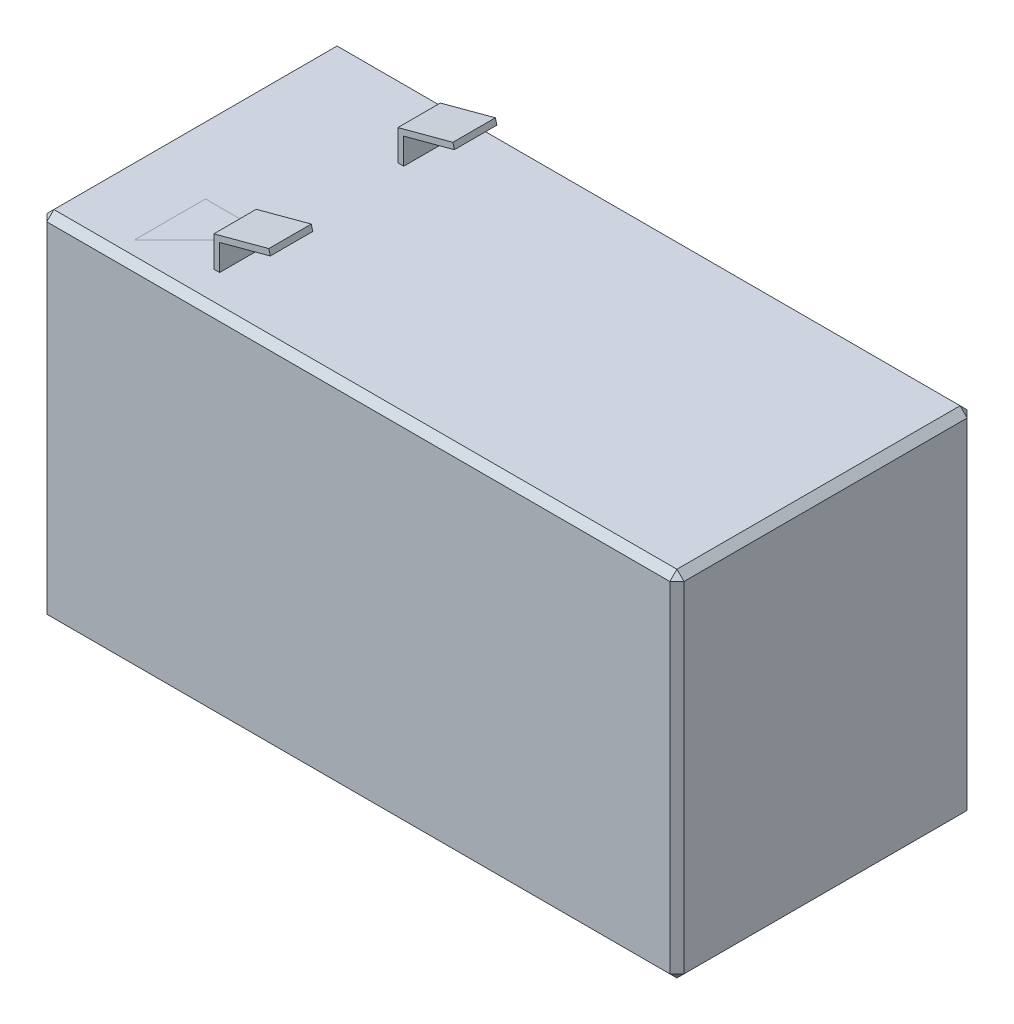
ISO-10303-21;
HEADER;
FILE_DESCRIPTION(('STEP AP214'),'2;1');
FILE_NAME('part.step','',(''),(''),'','','');
FILE_SCHEMA(('AUTOMOTIVE_DESIGN { 1 0 10303 214 1 1 1 1 }'));
ENDSEC;
DATA;
#1=APPLICATION_CONTEXT('core data for automotive mechanical design processes');
#2=APPLICATION_PROTOCOL_DEFINITION('international standard','automotive_design',2000,#1);
#3=PRODUCT_CONTEXT('',#1,'mechanical');
#4=PRODUCT('Part','Part','',(#3));
#5=PRODUCT_RELATED_PRODUCT_CATEGORY('part','',(#4));
#6=PRODUCT_DEFINITION_FORMATION('','',#4);
#7=PRODUCT_DEFINITION_CONTEXT('part definition',#1,'design');
#8=PRODUCT_DEFINITION('design','',#6,#7);
#9=PRODUCT_DEFINITION_SHAPE('','',#8);
#10=(LENGTH_UNIT() NAMED_UNIT(*) SI_UNIT(.MILLI.,.METRE.));
#11=(NAMED_UNIT(*) PLANE_ANGLE_UNIT() SI_UNIT($,.RADIAN.));
#12=(NAMED_UNIT(*) SI_UNIT($,.STERADIAN.) SOLID_ANGLE_UNIT());
#13=UNCERTAINTY_MEASURE_WITH_UNIT(LENGTH_MEASURE(1.E-05),#10,'distance_accuracy_value','');
#14=(GEOMETRIC_REPRESENTATION_CONTEXT(3) GLOBAL_UNCERTAINTY_ASSIGNED_CONTEXT((#13)) GLOBAL_UNIT_ASSIGNED_CONTEXT((#10,
#11,#12)) REPRESENTATION_CONTEXT('',''));
#15=CARTESIAN_POINT('',(0.,0.,0.));
#16=DIRECTION('',(0.,0.,1.));
#17=DIRECTION('',(1.,0.,0.));
#18=AXIS2_PLACEMENT_3D('',#15,#16,#17);
#19=CARTESIAN_POINT('',(0.,50.,0.));
#20=DIRECTION('',(0.,1.,0.));
#21=DIRECTION('',(0.,0.,1.));
#22=AXIS2_PLACEMENT_3D('',#19,#20,#21);
#23=PLANE('',#22);
#24=DIRECTION('',(0.,0.,-1.));
#25=VECTOR('',#24,1.);
#26=CARTESIAN_POINT('',(-24.585,50.,-7.99999999999999));
#27=LINE('',#26,#25);
#28=CARTESIAN_POINT('',(-24.585,50.,-7.99999999999999));
#29=VERTEX_POINT('',#28);
#30=CARTESIAN_POINT('',(-24.585,50.,-18.));
#31=VERTEX_POINT('',#30);
#32=EDGE_CURVE('E73',#29,#31,#27,.T.);
#33=ORIENTED_EDGE('',*,*,#32,.T.);
#34=DIRECTION('',(-1.,0.,0.));
#35=VECTOR('',#34,1.);
#36=CARTESIAN_POINT('',(-24.585,50.,-18.));
#37=LINE('',#36,#35);
#38=CARTESIAN_POINT('',(-34.585,50.,-18.));
#39=VERTEX_POINT('',#38);
#40=EDGE_CURVE('E84',#31,#39,#37,.T.);
#41=ORIENTED_EDGE('',*,*,#40,.T.);
#42=DIRECTION('',(0.,0.,1.));
#43=VECTOR('',#42,1.);
#44=CARTESIAN_POINT('',(-34.585,50.,-7.99999999999999));
#45=LINE('',#44,#43);
#46=CARTESIAN_POINT('',(-34.585,50.,-7.99999999999999));
#47=VERTEX_POINT('',#46);
#48=EDGE_CURVE('E69',#39,#47,#45,.T.);
#49=ORIENTED_EDGE('',*,*,#48,.T.);
#50=DIRECTION('',(1.,0.,0.));
#51=VECTOR('',#50,1.);
#52=CARTESIAN_POINT('',(-24.585,50.,-7.99999999999999));
#53=LINE('',#52,#51);
#54=EDGE_CURVE('E12',#47,#29,#53,.T.);
#55=ORIENTED_EDGE('',*,*,#54,.T.);
#56=EDGE_LOOP('',(#33,#41,#49,#55));
#57=FACE_BOUND('',#56,.T.);
#58=ADVANCED_FACE('F64',(#57),#23,.T.);
#59=OPEN_SHELL('',(#58));
#60=SHELL_BASED_SURFACE_MODEL('B2',(#59));
#61=CARTESIAN_POINT('',(0.,50.,0.));
#62=DIRECTION('',(0.,-1.,0.));
#63=DIRECTION('',(0.,0.,-1.));
#64=AXIS2_PLACEMENT_3D('',#61,#62,#63);
#65=PLANE('',#64);
#66=DIRECTION('',(0.,0.,-1.));
#67=VECTOR('',#66,1.);
#68=CARTESIAN_POINT('',(-24.585,50.,7.99999999999999));
#69=LINE('',#68,#67);
#70=CARTESIAN_POINT('',(-24.585,50.,18.));
#71=VERTEX_POINT('',#70);
#72=CARTESIAN_POINT('',(-24.585,50.,7.99999999999999));
#73=VERTEX_POINT('',#72);
#74=EDGE_CURVE('E133',#71,#73,#69,.T.);
#75=ORIENTED_EDGE('',*,*,#74,.T.);
#76=DIRECTION('',(-1.,0.,0.));
#77=VECTOR('',#76,1.);
#78=CARTESIAN_POINT('',(-24.585,50.,7.99999999999999));
#79=LINE('',#78,#77);
#80=CARTESIAN_POINT('',(-34.585,50.,8.));
#81=VERTEX_POINT('',#80);
#82=EDGE_CURVE('E144',#73,#81,#79,.T.);
#83=ORIENTED_EDGE('',*,*,#82,.T.);
#84=DIRECTION('',(0.,0.,1.));
#85=VECTOR('',#84,1.);
#86=CARTESIAN_POINT('',(-34.585,50.,8.));
#87=LINE('',#86,#85);
#88=CARTESIAN_POINT('',(-34.585,50.,18.));
#89=VERTEX_POINT('',#88);
#90=EDGE_CURVE('E129',#81,#89,#87,.T.);
#91=ORIENTED_EDGE('',*,*,#90,.T.);
#92=DIRECTION('',(1.,0.,0.));
#93=VECTOR('',#92,1.);
#94=CARTESIAN_POINT('',(-24.585,50.,18.));
#95=LINE('',#94,#93);
#96=EDGE_CURVE('E62',#89,#71,#95,.T.);
#97=ORIENTED_EDGE('',*,*,#96,.T.);
#98=EDGE_LOOP('',(#75,#83,#91,#97));
#99=FACE_BOUND('',#98,.T.);
#100=ADVANCED_FACE('F124',(#99),#65,.F.);
#101=OPEN_SHELL('',(#100));
#102=SHELL_BASED_SURFACE_MODEL('B6',(#101));
#103=CARTESIAN_POINT('',(0.,50.,0.));
#104=DIRECTION('',(0.,-1.,0.));
#105=DIRECTION('',(0.,0.,-1.));
#106=AXIS2_PLACEMENT_3D('',#103,#104,#105);
#107=PLANE('',#106);
#108=DIRECTION('',(-1.,0.,0.));
#109=VECTOR('',#108,1.);
#110=CARTESIAN_POINT('',(-24.585,50.,16.));
#111=LINE('',#110,#109);
#112=CARTESIAN_POINT('',(-24.585,50.,16.));
#113=VERTEX_POINT('',#112);
#114=CARTESIAN_POINT('',(-25.415,50.,16.));
#115=VERTEX_POINT('',#114);
#116=EDGE_CURVE('E431',#113,#115,#111,.T.);
#117=ORIENTED_EDGE('',*,*,#116,.T.);
#118=DIRECTION('',(0.,0.,-1.));
#119=VECTOR('',#118,1.);
#120=CARTESIAN_POINT('',(-25.415,50.,16.));
#121=LINE('',#120,#119);
#122=CARTESIAN_POINT('',(-25.415,50.,10.));
#123=VERTEX_POINT('',#122);
#124=EDGE_CURVE('E465',#115,#123,#121,.T.);
#125=ORIENTED_EDGE('',*,*,#124,.T.);
#126=DIRECTION('',(-1.,0.,0.));
#127=VECTOR('',#126,1.);
#128=CARTESIAN_POINT('',(-24.585,50.,10.));
#129=LINE('',#128,#127);
#130=CARTESIAN_POINT('',(-24.585,50.,10.));
#131=VERTEX_POINT('',#130);
#132=EDGE_CURVE('E454',#131,#123,#129,.T.);
#133=ORIENTED_EDGE('',*,*,#132,.F.);
#134=DIRECTION('',(0.,0.,-1.));
#135=VECTOR('',#134,1.);
#136=CARTESIAN_POINT('',(-24.585,50.,16.));
#137=LINE('',#136,#135);
#138=EDGE_CURVE('E462',#113,#131,#137,.T.);
#139=ORIENTED_EDGE('',*,*,#138,.F.);
#140=EDGE_LOOP('',(#117,#125,#133,#139));
#141=FACE_BOUND('',#140,.T.);
#142=DIRECTION('',(0.,0.,-1.));
#143=VECTOR('',#142,1.);
#144=CARTESIAN_POINT('',(44.,50.,0.));
#145=LINE('',#144,#143);
#146=CARTESIAN_POINT('',(44.,50.,20.));
#147=VERTEX_POINT('',#146);
#148=CARTESIAN_POINT('',(44.,50.,-20.));
#149=VERTEX_POINT('',#148);
#150=EDGE_CURVE('E508',#147,#149,#145,.T.);
#151=ORIENTED_EDGE('',*,*,#150,.T.);
#152=DIRECTION('',(-1.,0.,0.));
#153=VECTOR('',#152,1.);
#154=CARTESIAN_POINT('',(0.,50.,-20.));
#155=LINE('',#154,#153);
#156=CARTESIAN_POINT('',(-44.,50.,-20.));
#157=VERTEX_POINT('',#156);
#158=EDGE_CURVE('E515',#149,#157,#155,.T.);
#159=ORIENTED_EDGE('',*,*,#158,.T.);
#160=DIRECTION('',(0.,0.,1.));
#161=VECTOR('',#160,1.);
#162=CARTESIAN_POINT('',(-44.,50.,0.));
#163=LINE('',#162,#161);
#164=CARTESIAN_POINT('',(-44.,50.,20.));
#165=VERTEX_POINT('',#164);
#166=EDGE_CURVE('E511',#157,#165,#163,.T.);
#167=ORIENTED_EDGE('',*,*,#166,.T.);
#168=DIRECTION('',(1.,0.,0.));
#169=VECTOR('',#168,1.);
#170=CARTESIAN_POINT('',(0.,50.,20.));
#171=LINE('',#170,#169);
#172=EDGE_CURVE('E505',#165,#147,#171,.T.);
#173=ORIENTED_EDGE('',*,*,#172,.T.);
#174=EDGE_LOOP('',(#151,#159,#167,#173));
#175=FACE_BOUND('',#174,.T.);
#176=DIRECTION('',(-1.,0.,0.));
#177=VECTOR('',#176,1.);
#178=CARTESIAN_POINT('',(-24.585,50.,-16.));
#179=LINE('',#178,#177);
#180=CARTESIAN_POINT('',(-24.585,50.,-16.));
#181=VERTEX_POINT('',#180);
#182=CARTESIAN_POINT('',(-25.415,50.,-16.));
#183=VERTEX_POINT('',#182);
#184=EDGE_CURVE('E369',#181,#183,#179,.T.);
#185=ORIENTED_EDGE('',*,*,#184,.F.);
#186=DIRECTION('',(0.,0.,1.));
#187=VECTOR('',#186,1.);
#188=CARTESIAN_POINT('',(-24.585,50.,-16.));
#189=LINE('',#188,#187);
#190=CARTESIAN_POINT('',(-24.585,50.,-10.));
#191=VERTEX_POINT('',#190);
#192=EDGE_CURVE('E353',#181,#191,#189,.T.);
#193=ORIENTED_EDGE('',*,*,#192,.T.);
#194=DIRECTION('',(-1.,0.,0.));
#195=VECTOR('',#194,1.);
#196=CARTESIAN_POINT('',(-24.585,50.,-10.));
#197=LINE('',#196,#195);
#198=CARTESIAN_POINT('',(-25.415,50.,-10.));
#199=VERTEX_POINT('',#198);
#200=EDGE_CURVE('E390',#191,#199,#197,.T.);
#201=ORIENTED_EDGE('',*,*,#200,.T.);
#202=DIRECTION('',(0.,0.,1.));
#203=VECTOR('',#202,1.);
#204=CARTESIAN_POINT('',(-25.415,50.,-16.));
#205=LINE('',#204,#203);
#206=EDGE_CURVE('E411',#183,#199,#205,.T.);
#207=ORIENTED_EDGE('',*,*,#206,.F.);
#208=EDGE_LOOP('',(#185,#193,#201,#207));
#209=FACE_BOUND('',#208,.T.);
#210=ADVANCED_FACE('F175',(#141,#175,#209),#107,.F.);
#211=CARTESIAN_POINT('',(45.,50.,21.));
#212=DIRECTION('',(-1.,0.,0.));
#213=DIRECTION('',(0.,0.,1.));
#214=AXIS2_PLACEMENT_3D('',#211,#212,#213);
#215=PLANE('',#214);
#216=DIRECTION('',(0.,1.,0.));
#217=VECTOR('',#216,1.);
#218=CARTESIAN_POINT('',(45.,50.,-20.));
#219=LINE('',#218,#217);
#220=CARTESIAN_POINT('',(45.,0.999999999999987,-20.));
#221=VERTEX_POINT('',#220);
#222=CARTESIAN_POINT('',(45.,49.,-20.));
#223=VERTEX_POINT('',#222);
#224=EDGE_CURVE('E524',#221,#223,#219,.T.);
#225=ORIENTED_EDGE('',*,*,#224,.T.);
#226=DIRECTION('',(0.,0.,1.));
#227=VECTOR('',#226,1.);
#228=CARTESIAN_POINT('',(45.,49.,21.));
#229=LINE('',#228,#227);
#230=CARTESIAN_POINT('',(45.,49.,20.));
#231=VERTEX_POINT('',#230);
#232=EDGE_CURVE('E527',#223,#231,#229,.T.);
#233=ORIENTED_EDGE('',*,*,#232,.T.);
#234=DIRECTION('',(0.,-1.,0.));
#235=VECTOR('',#234,1.);
#236=CARTESIAN_POINT('',(45.,50.,20.));
#237=LINE('',#236,#235);
#238=CARTESIAN_POINT('',(45.,0.999999999999987,20.));
#239=VERTEX_POINT('',#238);
#240=EDGE_CURVE('E518',#231,#239,#237,.T.);
#241=ORIENTED_EDGE('',*,*,#240,.T.);
#242=DIRECTION('',(0.,0.,-1.));
#243=VECTOR('',#242,1.);
#244=CARTESIAN_POINT('',(45.,0.999999999999987,-21.));
#245=LINE('',#244,#243);
#246=EDGE_CURVE('E521',#239,#221,#245,.T.);
#247=ORIENTED_EDGE('',*,*,#246,.T.);
#248=EDGE_LOOP('',(#225,#233,#241,#247));
#249=FACE_BOUND('',#248,.T.);
#250=ADVANCED_FACE('F681',(#249),#215,.F.);
#251=CARTESIAN_POINT('',(-45.,50.,-21.));
#252=DIRECTION('',(0.,0.,1.));
#253=DIRECTION('',(1.,0.,0.));
#254=AXIS2_PLACEMENT_3D('',#251,#252,#253);
#255=PLANE('',#254);
#256=DIRECTION('',(1.,0.,0.));
#257=VECTOR('',#256,1.);
#258=CARTESIAN_POINT('',(-45.,49.,-21.));
#259=LINE('',#258,#257);
#260=CARTESIAN_POINT('',(-44.,49.,-21.));
#261=VERTEX_POINT('',#260);
#262=CARTESIAN_POINT('',(44.,49.,-21.));
#263=VERTEX_POINT('',#262);
#264=EDGE_CURVE('E536',#261,#263,#259,.T.);
#265=ORIENTED_EDGE('',*,*,#264,.T.);
#266=DIRECTION('',(0.,-1.,0.));
#267=VECTOR('',#266,1.);
#268=CARTESIAN_POINT('',(44.,50.,-21.));
#269=LINE('',#268,#267);
#270=CARTESIAN_POINT('',(44.,0.999999999999987,-21.));
#271=VERTEX_POINT('',#270);
#272=EDGE_CURVE('E539',#263,#271,#269,.T.);
#273=ORIENTED_EDGE('',*,*,#272,.T.);
#274=DIRECTION('',(-1.,0.,0.));
#275=VECTOR('',#274,1.);
#276=CARTESIAN_POINT('',(-45.,0.999999999999987,-21.));
#277=LINE('',#276,#275);
#278=CARTESIAN_POINT('',(-44.,0.999999999999987,-21.));
#279=VERTEX_POINT('',#278);
#280=EDGE_CURVE('E531',#271,#279,#277,.T.);
#281=ORIENTED_EDGE('',*,*,#280,.T.);
#282=DIRECTION('',(0.,1.,0.));
#283=VECTOR('',#282,1.);
#284=CARTESIAN_POINT('',(-44.,50.,-21.));
#285=LINE('',#284,#283);
#286=EDGE_CURVE('E534',#279,#261,#285,.T.);
#287=ORIENTED_EDGE('',*,*,#286,.T.);
#288=EDGE_LOOP('',(#265,#273,#281,#287));
#289=FACE_BOUND('',#288,.T.);
#290=ADVANCED_FACE('F658',(#289),#255,.F.);
#291=CARTESIAN_POINT('',(-45.,50.,21.));
#292=DIRECTION('',(1.,0.,0.));
#293=DIRECTION('',(0.,0.,-1.));
#294=AXIS2_PLACEMENT_3D('',#291,#292,#293);
#295=PLANE('',#294);
#296=DIRECTION('',(0.,0.,-1.));
#297=VECTOR('',#296,1.);
#298=CARTESIAN_POINT('',(-45.,49.,21.));
#299=LINE('',#298,#297);
#300=CARTESIAN_POINT('',(-45.,49.,20.));
#301=VERTEX_POINT('',#300);
#302=CARTESIAN_POINT('',(-45.,49.,-20.));
#303=VERTEX_POINT('',#302);
#304=EDGE_CURVE('E482',#301,#303,#299,.T.);
#305=ORIENTED_EDGE('',*,*,#304,.T.);
#306=DIRECTION('',(0.,-1.,0.));
#307=VECTOR('',#306,1.);
#308=CARTESIAN_POINT('',(-45.,50.,-20.));
#309=LINE('',#308,#307);
#310=CARTESIAN_POINT('',(-45.,0.999999999999987,-20.));
#311=VERTEX_POINT('',#310);
#312=EDGE_CURVE('E489',#303,#311,#309,.T.);
#313=ORIENTED_EDGE('',*,*,#312,.T.);
#314=DIRECTION('',(0.,0.,1.));
#315=VECTOR('',#314,1.);
#316=CARTESIAN_POINT('',(-45.,0.999999999999987,21.));
#317=LINE('',#316,#315);
#318=CARTESIAN_POINT('',(-45.,0.999999999999987,20.));
#319=VERTEX_POINT('',#318);
#320=EDGE_CURVE('E485',#311,#319,#317,.T.);
#321=ORIENTED_EDGE('',*,*,#320,.T.);
#322=DIRECTION('',(0.,1.,0.));
#323=VECTOR('',#322,1.);
#324=CARTESIAN_POINT('',(-45.,50.,20.));
#325=LINE('',#324,#323);
#326=EDGE_CURVE('E479',#319,#301,#325,.T.);
#327=ORIENTED_EDGE('',*,*,#326,.T.);
#328=EDGE_LOOP('',(#305,#313,#321,#327));
#329=FACE_BOUND('',#328,.T.);
#330=ADVANCED_FACE('F743',(#329),#295,.F.);
#331=CARTESIAN_POINT('',(-45.,50.,21.));
#332=DIRECTION('',(0.,0.,-1.));
#333=DIRECTION('',(-1.,0.,0.));
#334=AXIS2_PLACEMENT_3D('',#331,#332,#333);
#335=PLANE('',#334);
#336=DIRECTION('',(-1.,0.,0.));
#337=VECTOR('',#336,1.);
#338=CARTESIAN_POINT('',(-45.,49.,21.));
#339=LINE('',#338,#337);
#340=CARTESIAN_POINT('',(44.,49.,21.));
#341=VERTEX_POINT('',#340);
#342=CARTESIAN_POINT('',(-44.,49.,21.));
#343=VERTEX_POINT('',#342);
#344=EDGE_CURVE('E186',#341,#343,#339,.T.);
#345=ORIENTED_EDGE('',*,*,#344,.T.);
#346=DIRECTION('',(0.,-1.,0.));
#347=VECTOR('',#346,1.);
#348=CARTESIAN_POINT('',(-44.,50.,21.));
#349=LINE('',#348,#347);
#350=CARTESIAN_POINT('',(-44.,0.999999999999987,21.));
#351=VERTEX_POINT('',#350);
#352=EDGE_CURVE('E122',#343,#351,#349,.T.);
#353=ORIENTED_EDGE('',*,*,#352,.T.);
#354=DIRECTION('',(1.,0.,0.));
#355=VECTOR('',#354,1.);
#356=CARTESIAN_POINT('',(45.,0.999999999999987,21.));
#357=LINE('',#356,#355);
#358=CARTESIAN_POINT('',(44.,0.999999999999987,21.));
#359=VERTEX_POINT('',#358);
#360=EDGE_CURVE('E543',#351,#359,#357,.T.);
#361=ORIENTED_EDGE('',*,*,#360,.T.);
#362=DIRECTION('',(0.,1.,0.));
#363=VECTOR('',#362,1.);
#364=CARTESIAN_POINT('',(44.,50.,21.));
#365=LINE('',#364,#363);
#366=EDGE_CURVE('E546',#359,#341,#365,.T.);
#367=ORIENTED_EDGE('',*,*,#366,.T.);
#368=EDGE_LOOP('',(#345,#353,#361,#367));
#369=FACE_BOUND('',#368,.T.);
#370=ADVANCED_FACE('F740',(#369),#335,.F.);
#371=CARTESIAN_POINT('',(0.,0.,0.));
#372=DIRECTION('',(0.,-1.,0.));
#373=DIRECTION('',(0.,0.,-1.));
#374=AXIS2_PLACEMENT_3D('',#371,#372,#373);
#375=PLANE('',#374);
#376=DIRECTION('',(-1.,0.,0.));
#377=VECTOR('',#376,1.);
#378=CARTESIAN_POINT('',(-45.,0.,20.));
#379=LINE('',#378,#377);
#380=CARTESIAN_POINT('',(44.,0.,20.));
#381=VERTEX_POINT('',#380);
#382=CARTESIAN_POINT('',(-44.,0.,20.));
#383=VERTEX_POINT('',#382);
#384=EDGE_CURVE('E492',#381,#383,#379,.T.);
#385=ORIENTED_EDGE('',*,*,#384,.T.);
#386=DIRECTION('',(0.,0.,-1.));
#387=VECTOR('',#386,1.);
#388=CARTESIAN_POINT('',(-44.,0.,-21.));
#389=LINE('',#388,#387);
#390=CARTESIAN_POINT('',(-44.,0.,-20.));
#391=VERTEX_POINT('',#390);
#392=EDGE_CURVE('E501',#383,#391,#389,.T.);
#393=ORIENTED_EDGE('',*,*,#392,.T.);
#394=DIRECTION('',(1.,0.,0.));
#395=VECTOR('',#394,1.);
#396=CARTESIAN_POINT('',(45.,0.,-20.));
#397=LINE('',#396,#395);
#398=CARTESIAN_POINT('',(44.,0.,-20.));
#399=VERTEX_POINT('',#398);
#400=EDGE_CURVE('E498',#391,#399,#397,.T.);
#401=ORIENTED_EDGE('',*,*,#400,.T.);
#402=DIRECTION('',(0.,0.,1.));
#403=VECTOR('',#402,1.);
#404=CARTESIAN_POINT('',(44.,0.,21.));
#405=LINE('',#404,#403);
#406=EDGE_CURVE('E495',#399,#381,#405,.T.);
#407=ORIENTED_EDGE('',*,*,#406,.T.);
#408=EDGE_LOOP('',(#385,#393,#401,#407));
#409=FACE_BOUND('',#408,.T.);
#410=ADVANCED_FACE('F701',(#409),#375,.T.);
#411=CARTESIAN_POINT('',(44.,50.,0.));
#412=DIRECTION('',(-0.707106781186547,-0.707106781186547,0.));
#413=DIRECTION('',(0.,0.,-1.));
#414=AXIS2_PLACEMENT_3D('',#411,#412,#413);
#415=PLANE('',#414);
#416=DIRECTION('',(-0.707106781186547,0.707106781186547,0.));
#417=VECTOR('',#416,1.);
#418=CARTESIAN_POINT('',(44.,50.,-20.));
#419=LINE('',#418,#417);
#420=EDGE_CURVE('E180',#149,#223,#419,.F.);
#421=ORIENTED_EDGE('',*,*,#420,.F.);
#422=ORIENTED_EDGE('',*,*,#150,.F.);
#423=DIRECTION('',(0.707106781186547,-0.707106781186547,0.));
#424=VECTOR('',#423,1.);
#425=CARTESIAN_POINT('',(45.,49.,20.));
#426=LINE('',#425,#424);
#427=EDGE_CURVE('E633',#231,#147,#426,.F.);
#428=ORIENTED_EDGE('',*,*,#427,.F.);
#429=ORIENTED_EDGE('',*,*,#232,.F.);
#430=EDGE_LOOP('',(#421,#422,#428,#429));
#431=FACE_BOUND('',#430,.T.);
#432=ADVANCED_FACE('F178',(#431),#415,.F.);
#433=CARTESIAN_POINT('',(44.,50.,-20.));
#434=DIRECTION('',(0.577350269189626,0.577350269189622,-0.57735026918963));
#435=DIRECTION('',(-0.70710678118655,0.,-0.707106781186545));
#436=AXIS2_PLACEMENT_3D('',#433,#434,#435);
#437=PLANE('',#436);
#438=DIRECTION('',(0.,-0.707106781186547,-0.707106781186547));
#439=VECTOR('',#438,1.);
#440=CARTESIAN_POINT('',(44.,50.,-20.));
#441=LINE('',#440,#439);
#442=EDGE_CURVE('E626',#149,#263,#441,.T.);
#443=ORIENTED_EDGE('',*,*,#442,.F.);
#444=ORIENTED_EDGE('',*,*,#420,.T.);
#445=DIRECTION('',(0.70710678118655,0.,0.707106781186545));
#446=VECTOR('',#445,1.);
#447=CARTESIAN_POINT('',(44.5,49.,-20.5));
#448=LINE('',#447,#446);
#449=EDGE_CURVE('E630',#263,#223,#448,.T.);
#450=ORIENTED_EDGE('',*,*,#449,.F.);
#451=EDGE_LOOP('',(#443,#444,#450));
#452=FACE_BOUND('',#451,.T.);
#453=ADVANCED_FACE('F646',(#452),#437,.T.);
#454=CARTESIAN_POINT('',(45.,49.,20.));
#455=DIRECTION('',(0.577350269189623,0.577350269189623,0.577350269189631));
#456=DIRECTION('',(0.707106781186552,0.,-0.707106781186543));
#457=AXIS2_PLACEMENT_3D('',#454,#455,#456);
#458=PLANE('',#457);
#459=DIRECTION('',(-0.707106781186552,0.,0.707106781186543));
#460=VECTOR('',#459,1.);
#461=CARTESIAN_POINT('',(45.,49.,20.));
#462=LINE('',#461,#460);
#463=EDGE_CURVE('E618',#231,#341,#462,.T.);
#464=ORIENTED_EDGE('',*,*,#463,.F.);
#465=ORIENTED_EDGE('',*,*,#427,.T.);
#466=DIRECTION('',(0.,0.707106781186548,-0.707106781186548));
#467=VECTOR('',#466,1.);
#468=CARTESIAN_POINT('',(44.,49.5,20.5));
#469=LINE('',#468,#467);
#470=EDGE_CURVE('E622',#341,#147,#469,.T.);
#471=ORIENTED_EDGE('',*,*,#470,.F.);
#472=EDGE_LOOP('',(#464,#465,#471));
#473=FACE_BOUND('',#472,.T.);
#474=ADVANCED_FACE('F832',(#473),#458,.T.);
#475=CARTESIAN_POINT('',(44.,50.,-21.));
#476=DIRECTION('',(-0.707106781186545,0.,0.70710678118655));
#477=DIRECTION('',(0.,-1.,0.));
#478=AXIS2_PLACEMENT_3D('',#475,#476,#477);
#479=PLANE('',#478);
#480=ORIENTED_EDGE('',*,*,#449,.T.);
#481=ORIENTED_EDGE('',*,*,#224,.F.);
#482=DIRECTION('',(-0.70710678118655,0.,-0.707106781186545));
#483=VECTOR('',#482,1.);
#484=CARTESIAN_POINT('',(44.,0.999999999999987,-21.));
#485=LINE('',#484,#483);
#486=EDGE_CURVE('E610',#271,#221,#485,.F.);
#487=ORIENTED_EDGE('',*,*,#486,.F.);
#488=ORIENTED_EDGE('',*,*,#272,.F.);
#489=EDGE_LOOP('',(#480,#481,#487,#488));
#490=FACE_BOUND('',#489,.T.);
#491=ADVANCED_FACE('F654',(#490),#479,.F.);
#492=CARTESIAN_POINT('',(0.,50.,-20.));
#493=DIRECTION('',(0.,-0.707106781186547,0.707106781186547));
#494=DIRECTION('',(-1.,0.,0.));
#495=AXIS2_PLACEMENT_3D('',#492,#493,#494);
#496=PLANE('',#495);
#497=ORIENTED_EDGE('',*,*,#442,.T.);
#498=ORIENTED_EDGE('',*,*,#264,.F.);
#499=DIRECTION('',(0.,0.707106781186547,0.707106781186547));
#500=VECTOR('',#499,1.);
#501=CARTESIAN_POINT('',(-44.,49.5,-20.5));
#502=LINE('',#501,#500);
#503=EDGE_CURVE('E606',#157,#261,#502,.F.);
#504=ORIENTED_EDGE('',*,*,#503,.F.);
#505=ORIENTED_EDGE('',*,*,#158,.F.);
#506=EDGE_LOOP('',(#497,#498,#504,#505));
#507=FACE_BOUND('',#506,.T.);
#508=ADVANCED_FACE('F663',(#507),#496,.F.);
#509=CARTESIAN_POINT('',(-44.,50.,0.));
#510=DIRECTION('',(0.707106781186547,-0.707106781186547,0.));
#511=DIRECTION('',(0.,0.,1.));
#512=AXIS2_PLACEMENT_3D('',#509,#510,#511);
#513=PLANE('',#512);
#514=DIRECTION('',(0.707106781186547,0.707106781186547,0.));
#515=VECTOR('',#514,1.);
#516=CARTESIAN_POINT('',(-44.,50.,20.));
#517=LINE('',#516,#515);
#518=EDGE_CURVE('E598',#165,#301,#517,.F.);
#519=ORIENTED_EDGE('',*,*,#518,.F.);
#520=ORIENTED_EDGE('',*,*,#166,.F.);
#521=DIRECTION('',(-0.707106781186548,-0.707106781186548,0.));
#522=VECTOR('',#521,1.);
#523=CARTESIAN_POINT('',(-45.,49.,-20.));
#524=LINE('',#523,#522);
#525=EDGE_CURVE('E602',#303,#157,#524,.F.);
#526=ORIENTED_EDGE('',*,*,#525,.F.);
#527=ORIENTED_EDGE('',*,*,#304,.F.);
#528=EDGE_LOOP('',(#519,#520,#526,#527));
#529=FACE_BOUND('',#528,.T.);
#530=ADVANCED_FACE('F670',(#529),#513,.F.);
#531=CARTESIAN_POINT('',(0.,50.,20.));
#532=DIRECTION('',(0.,-0.707106781186547,-0.707106781186547));
#533=DIRECTION('',(1.,0.,0.));
#534=AXIS2_PLACEMENT_3D('',#531,#532,#533);
#535=PLANE('',#534);
#536=ORIENTED_EDGE('',*,*,#470,.T.);
#537=ORIENTED_EDGE('',*,*,#172,.F.);
#538=DIRECTION('',(0.,-0.707106781186547,0.707106781186547));
#539=VECTOR('',#538,1.);
#540=CARTESIAN_POINT('',(-44.,50.,20.));
#541=LINE('',#540,#539);
#542=EDGE_CURVE('E595',#343,#165,#541,.F.);
#543=ORIENTED_EDGE('',*,*,#542,.F.);
#544=ORIENTED_EDGE('',*,*,#344,.F.);
#545=EDGE_LOOP('',(#536,#537,#543,#544));
#546=FACE_BOUND('',#545,.T.);
#547=ADVANCED_FACE('F678',(#546),#535,.F.);
#548=CARTESIAN_POINT('',(45.,50.,20.));
#549=DIRECTION('',(-0.707106781186543,0.,-0.707106781186552));
#550=DIRECTION('',(0.,-1.,0.));
#551=AXIS2_PLACEMENT_3D('',#548,#549,#550);
#552=PLANE('',#551);
#553=ORIENTED_EDGE('',*,*,#463,.T.);
#554=ORIENTED_EDGE('',*,*,#366,.F.);
#555=DIRECTION('',(0.707106781186552,0.,-0.707106781186543));
#556=VECTOR('',#555,1.);
#557=CARTESIAN_POINT('',(44.5,0.999999999999987,20.5));
#558=LINE('',#557,#556);
#559=EDGE_CURVE('E591',#239,#359,#558,.F.);
#560=ORIENTED_EDGE('',*,*,#559,.F.);
#561=ORIENTED_EDGE('',*,*,#240,.F.);
#562=EDGE_LOOP('',(#553,#554,#560,#561));
#563=FACE_BOUND('',#562,.T.);
#564=ADVANCED_FACE('F691',(#563),#552,.F.);
#565=CARTESIAN_POINT('',(45.,0.999999999999987,21.));
#566=DIRECTION('',(0.707106781186547,-0.707106781186547,0.));
#567=DIRECTION('',(0.,0.,1.));
#568=AXIS2_PLACEMENT_3D('',#565,#566,#567);
#569=PLANE('',#568);
#570=DIRECTION('',(-0.707106781186547,-0.707106781186547,0.));
#571=VECTOR('',#570,1.);
#572=CARTESIAN_POINT('',(44.5,0.499999999999983,-20.));
#573=LINE('',#572,#571);
#574=EDGE_CURVE('E614',#221,#399,#573,.T.);
#575=ORIENTED_EDGE('',*,*,#574,.F.);
#576=ORIENTED_EDGE('',*,*,#246,.F.);
#577=DIRECTION('',(0.707106781186548,0.707106781186548,0.));
#578=VECTOR('',#577,1.);
#579=CARTESIAN_POINT('',(44.,0.,20.));
#580=LINE('',#579,#578);
#581=EDGE_CURVE('E587',#381,#239,#580,.T.);
#582=ORIENTED_EDGE('',*,*,#581,.F.);
#583=ORIENTED_EDGE('',*,*,#406,.F.);
#584=EDGE_LOOP('',(#575,#576,#582,#583));
#585=FACE_BOUND('',#584,.T.);
#586=ADVANCED_FACE('F686',(#585),#569,.T.);
#587=CARTESIAN_POINT('',(44.,0.999999999999987,-21.));
#588=DIRECTION('',(0.577350269189626,-0.577350269189622,-0.57735026918963));
#589=DIRECTION('',(-0.70710678118655,0.,-0.707106781186545));
#590=AXIS2_PLACEMENT_3D('',#587,#588,#589);
#591=PLANE('',#590);
#592=ORIENTED_EDGE('',*,*,#486,.T.);
#593=ORIENTED_EDGE('',*,*,#574,.T.);
#594=DIRECTION('',(0.,0.707106781186547,-0.707106781186547));
#595=VECTOR('',#594,1.);
#596=CARTESIAN_POINT('',(44.,0.999999999999987,-21.));
#597=LINE('',#596,#595);
#598=EDGE_CURVE('E583',#271,#399,#597,.F.);
#599=ORIENTED_EDGE('',*,*,#598,.F.);
#600=EDGE_LOOP('',(#592,#593,#599));
#601=FACE_BOUND('',#600,.T.);
#602=ADVANCED_FACE('F705',(#601),#591,.T.);
#603=CARTESIAN_POINT('',(-45.,49.,-20.));
#604=DIRECTION('',(-0.577350269189628,0.577350269189624,-0.577350269189625));
#605=DIRECTION('',(-0.707106781186545,0.,0.70710678118655));
#606=AXIS2_PLACEMENT_3D('',#603,#604,#605);
#607=PLANE('',#606);
#608=ORIENTED_EDGE('',*,*,#525,.T.);
#609=ORIENTED_EDGE('',*,*,#503,.T.);
#610=DIRECTION('',(0.707106781186545,0.,-0.70710678118655));
#611=VECTOR('',#610,1.);
#612=CARTESIAN_POINT('',(-45.,49.,-20.));
#613=LINE('',#612,#611);
#614=EDGE_CURVE('E579',#303,#261,#613,.T.);
#615=ORIENTED_EDGE('',*,*,#614,.F.);
#616=EDGE_LOOP('',(#608,#609,#615));
#617=FACE_BOUND('',#616,.T.);
#618=ADVANCED_FACE('F718',(#617),#607,.T.);
#619=CARTESIAN_POINT('',(-44.,50.,20.));
#620=DIRECTION('',(-0.577350269189626,0.577350269189626,0.577350269189626));
#621=DIRECTION('',(0.707106781186547,0.,0.707106781186547));
#622=AXIS2_PLACEMENT_3D('',#619,#620,#621);
#623=PLANE('',#622);
#624=ORIENTED_EDGE('',*,*,#542,.T.);
#625=ORIENTED_EDGE('',*,*,#518,.T.);
#626=DIRECTION('',(-0.707106781186547,0.,-0.707106781186547));
#627=VECTOR('',#626,1.);
#628=CARTESIAN_POINT('',(-44.5,49.,20.5));
#629=LINE('',#628,#627);
#630=EDGE_CURVE('E575',#343,#301,#629,.T.);
#631=ORIENTED_EDGE('',*,*,#630,.F.);
#632=EDGE_LOOP('',(#624,#625,#631));
#633=FACE_BOUND('',#632,.T.);
#634=ADVANCED_FACE('F720',(#633),#623,.T.);
#635=CARTESIAN_POINT('',(44.,0.,20.));
#636=DIRECTION('',(0.577350269189623,-0.577350269189623,0.577350269189631));
#637=DIRECTION('',(0.707106781186552,0.,-0.707106781186542));
#638=AXIS2_PLACEMENT_3D('',#635,#636,#637);
#639=PLANE('',#638);
#640=ORIENTED_EDGE('',*,*,#581,.T.);
#641=ORIENTED_EDGE('',*,*,#559,.T.);
#642=DIRECTION('',(0.,-0.707106781186548,-0.707106781186548));
#643=VECTOR('',#642,1.);
#644=CARTESIAN_POINT('',(44.,0.,20.));
#645=LINE('',#644,#643);
#646=EDGE_CURVE('E571',#381,#359,#645,.F.);
#647=ORIENTED_EDGE('',*,*,#646,.F.);
#648=EDGE_LOOP('',(#640,#641,#647));
#649=FACE_BOUND('',#648,.T.);
#650=ADVANCED_FACE('F693',(#649),#639,.T.);
#651=CARTESIAN_POINT('',(-45.,0.999999999999987,-21.));
#652=DIRECTION('',(0.,-0.707106781186547,-0.707106781186547));
#653=DIRECTION('',(1.,0.,0.));
#654=AXIS2_PLACEMENT_3D('',#651,#652,#653);
#655=PLANE('',#654);
#656=ORIENTED_EDGE('',*,*,#598,.T.);
#657=ORIENTED_EDGE('',*,*,#400,.F.);
#658=DIRECTION('',(0.,-0.707106781186548,0.707106781186548));
#659=VECTOR('',#658,1.);
#660=CARTESIAN_POINT('',(-44.,0.,-20.));
#661=LINE('',#660,#659);
#662=EDGE_CURVE('E567',#279,#391,#661,.T.);
#663=ORIENTED_EDGE('',*,*,#662,.F.);
#664=ORIENTED_EDGE('',*,*,#280,.F.);
#665=EDGE_LOOP('',(#656,#657,#663,#664));
#666=FACE_BOUND('',#665,.T.);
#667=ADVANCED_FACE('F707',(#666),#655,.T.);
#668=CARTESIAN_POINT('',(-45.,50.,-20.));
#669=DIRECTION('',(0.70710678118655,0.,0.707106781186545));
#670=DIRECTION('',(0.,-1.,0.));
#671=AXIS2_PLACEMENT_3D('',#668,#669,#670);
#672=PLANE('',#671);
#673=ORIENTED_EDGE('',*,*,#614,.T.);
#674=ORIENTED_EDGE('',*,*,#286,.F.);
#675=DIRECTION('',(-0.707106781186545,0.,0.70710678118655));
#676=VECTOR('',#675,1.);
#677=CARTESIAN_POINT('',(-44.5,0.999999999999987,-20.5));
#678=LINE('',#677,#676);
#679=EDGE_CURVE('E563',#311,#279,#678,.F.);
#680=ORIENTED_EDGE('',*,*,#679,.F.);
#681=ORIENTED_EDGE('',*,*,#312,.F.);
#682=EDGE_LOOP('',(#673,#674,#680,#681));
#683=FACE_BOUND('',#682,.T.);
#684=ADVANCED_FACE('F716',(#683),#672,.F.);
#685=CARTESIAN_POINT('',(-44.,50.,21.));
#686=DIRECTION('',(0.707106781186547,0.,-0.707106781186547));
#687=DIRECTION('',(0.,-1.,0.));
#688=AXIS2_PLACEMENT_3D('',#685,#686,#687);
#689=PLANE('',#688);
#690=ORIENTED_EDGE('',*,*,#630,.T.);
#691=ORIENTED_EDGE('',*,*,#326,.F.);
#692=DIRECTION('',(0.707106781186547,0.,0.707106781186547));
#693=VECTOR('',#692,1.);
#694=CARTESIAN_POINT('',(-45.,0.999999999999987,20.));
#695=LINE('',#694,#693);
#696=EDGE_CURVE('E559',#351,#319,#695,.F.);
#697=ORIENTED_EDGE('',*,*,#696,.F.);
#698=ORIENTED_EDGE('',*,*,#352,.F.);
#699=EDGE_LOOP('',(#690,#691,#697,#698));
#700=FACE_BOUND('',#699,.T.);
#701=ADVANCED_FACE('F775',(#700),#689,.F.);
#702=CARTESIAN_POINT('',(-45.,0.999999999999987,21.));
#703=DIRECTION('',(0.,-0.707106781186547,0.707106781186547));
#704=DIRECTION('',(-1.,0.,0.));
#705=AXIS2_PLACEMENT_3D('',#702,#703,#704);
#706=PLANE('',#705);
#707=ORIENTED_EDGE('',*,*,#646,.T.);
#708=ORIENTED_EDGE('',*,*,#360,.F.);
#709=DIRECTION('',(0.,0.707106781186547,0.707106781186547));
#710=VECTOR('',#709,1.);
#711=CARTESIAN_POINT('',(-44.,0.499999999999994,20.5));
#712=LINE('',#711,#710);
#713=EDGE_CURVE('E556',#383,#351,#712,.T.);
#714=ORIENTED_EDGE('',*,*,#713,.F.);
#715=ORIENTED_EDGE('',*,*,#384,.F.);
#716=EDGE_LOOP('',(#707,#708,#714,#715));
#717=FACE_BOUND('',#716,.T.);
#718=ADVANCED_FACE('F698',(#717),#706,.T.);
#719=CARTESIAN_POINT('',(-44.,0.,-20.));
#720=DIRECTION('',(-0.577350269189629,-0.577350269189624,-0.577350269189624));
#721=DIRECTION('',(-0.707106781186545,0.,0.70710678118655));
#722=AXIS2_PLACEMENT_3D('',#719,#720,#721);
#723=PLANE('',#722);
#724=ORIENTED_EDGE('',*,*,#679,.T.);
#725=ORIENTED_EDGE('',*,*,#662,.T.);
#726=DIRECTION('',(-0.707106781186547,0.707106781186547,0.));
#727=VECTOR('',#726,1.);
#728=CARTESIAN_POINT('',(-44.,0.,-20.));
#729=LINE('',#728,#727);
#730=EDGE_CURVE('E553',#311,#391,#729,.F.);
#731=ORIENTED_EDGE('',*,*,#730,.F.);
#732=EDGE_LOOP('',(#724,#725,#731));
#733=FACE_BOUND('',#732,.T.);
#734=ADVANCED_FACE('F712',(#733),#723,.T.);
#735=CARTESIAN_POINT('',(-45.,0.999999999999987,20.));
#736=DIRECTION('',(-0.577350269189626,-0.577350269189626,0.577350269189626));
#737=DIRECTION('',(0.707106781186547,0.,0.707106781186547));
#738=AXIS2_PLACEMENT_3D('',#735,#736,#737);
#739=PLANE('',#738);
#740=ORIENTED_EDGE('',*,*,#713,.T.);
#741=ORIENTED_EDGE('',*,*,#696,.T.);
#742=DIRECTION('',(0.707106781186547,-0.707106781186547,0.));
#743=VECTOR('',#742,1.);
#744=CARTESIAN_POINT('',(-45.,0.999999999999987,20.));
#745=LINE('',#744,#743);
#746=EDGE_CURVE('E478',#383,#319,#745,.F.);
#747=ORIENTED_EDGE('',*,*,#746,.F.);
#748=EDGE_LOOP('',(#740,#741,#747));
#749=FACE_BOUND('',#748,.T.);
#750=ADVANCED_FACE('F757',(#749),#739,.T.);
#751=CARTESIAN_POINT('',(-45.,0.999999999999987,21.));
#752=DIRECTION('',(-0.707106781186547,-0.707106781186547,0.));
#753=DIRECTION('',(0.,0.,-1.));
#754=AXIS2_PLACEMENT_3D('',#751,#752,#753);
#755=PLANE('',#754);
#756=ORIENTED_EDGE('',*,*,#730,.T.);
#757=ORIENTED_EDGE('',*,*,#392,.F.);
#758=ORIENTED_EDGE('',*,*,#746,.T.);
#759=ORIENTED_EDGE('',*,*,#320,.F.);
#760=EDGE_LOOP('',(#756,#757,#758,#759));
#761=FACE_BOUND('',#760,.T.);
#762=ADVANCED_FACE('F751',(#761),#755,.T.);
#763=CARTESIAN_POINT('',(-24.8925900962825,53.59914078209,16.));
#764=DIRECTION('',(-0.258819045102522,0.965925826289068,0.));
#765=DIRECTION('',(-0.965925826289068,-0.258819045102522,0.));
#766=AXIS2_PLACEMENT_3D('',#763,#764,#765);
#767=PLANE('',#766);
#768=DIRECTION('',(0.965925826289068,0.258819045102522,0.));
#769=VECTOR('',#768,1.);
#770=CARTESIAN_POINT('',(-24.8925900962825,53.59914078209,10.));
#771=LINE('',#770,#769);
#772=CARTESIAN_POINT('',(-24.585,53.6815592999887,10.));
#773=VERTEX_POINT('',#772);
#774=CARTESIAN_POINT('',(-17.4284884811448,55.59914078209,10.));
#775=VERTEX_POINT('',#774);
#776=EDGE_CURVE('E352',#773,#775,#771,.T.);
#777=ORIENTED_EDGE('',*,*,#776,.T.);
#778=DIRECTION('',(0.,0.,-1.));
#779=VECTOR('',#778,1.);
#780=CARTESIAN_POINT('',(-17.4284884811448,55.59914078209,16.));
#781=LINE('',#780,#779);
#782=CARTESIAN_POINT('',(-17.4284884811448,55.59914078209,16.));
#783=VERTEX_POINT('',#782);
#784=EDGE_CURVE('E475',#783,#775,#781,.T.);
#785=ORIENTED_EDGE('',*,*,#784,.F.);
#786=DIRECTION('',(0.965925826289068,0.258819045102522,0.));
#787=VECTOR('',#786,1.);
#788=CARTESIAN_POINT('',(-24.8925900962825,53.59914078209,16.));
#789=LINE('',#788,#787);
#790=CARTESIAN_POINT('',(-24.585,53.6815592999887,16.));
#791=VERTEX_POINT('',#790);
#792=EDGE_CURVE('E416',#791,#783,#789,.T.);
#793=ORIENTED_EDGE('',*,*,#792,.F.);
#794=DIRECTION('',(0.,0.,-1.));
#795=VECTOR('',#794,1.);
#796=CARTESIAN_POINT('',(-24.585,53.6815592999887,16.));
#797=LINE('',#796,#795);
#798=EDGE_CURVE('E438',#791,#773,#797,.T.);
#799=ORIENTED_EDGE('',*,*,#798,.T.);
#800=EDGE_LOOP('',(#777,#785,#793,#799));
#801=FACE_BOUND('',#800,.T.);
#802=ADVANCED_FACE('F736',(#801),#767,.F.);
#803=CARTESIAN_POINT('',(-17.6433082885799,56.40085921791,16.));
#804=DIRECTION('',(0.965925826289067,0.258819045102524,0.));
#805=DIRECTION('',(-0.258819045102524,0.965925826289067,0.));
#806=AXIS2_PLACEMENT_3D('',#803,#804,#805);
#807=PLANE('',#806);
#808=DIRECTION('',(0.258819045102524,-0.965925826289067,0.));
#809=VECTOR('',#808,1.);
#810=CARTESIAN_POINT('',(-17.6433082885799,56.40085921791,10.));
#811=LINE('',#810,#809);
#812=CARTESIAN_POINT('',(-17.6433082885799,56.40085921791,10.));
#813=VERTEX_POINT('',#812);
#814=EDGE_CURVE('E442',#813,#775,#811,.T.);
#815=ORIENTED_EDGE('',*,*,#814,.F.);
#816=DIRECTION('',(0.,0.,-1.));
#817=VECTOR('',#816,1.);
#818=CARTESIAN_POINT('',(-17.6433082885799,56.40085921791,16.));
#819=LINE('',#818,#817);
#820=CARTESIAN_POINT('',(-17.6433082885799,56.40085921791,16.));
#821=VERTEX_POINT('',#820);
#822=EDGE_CURVE('E472',#821,#813,#819,.T.);
#823=ORIENTED_EDGE('',*,*,#822,.F.);
#824=DIRECTION('',(0.258819045102524,-0.965925826289067,0.));
#825=VECTOR('',#824,1.);
#826=CARTESIAN_POINT('',(-17.6433082885799,56.40085921791,16.));
#827=LINE('',#826,#825);
#828=EDGE_CURVE('E419',#821,#783,#827,.T.);
#829=ORIENTED_EDGE('',*,*,#828,.T.);
#830=ORIENTED_EDGE('',*,*,#784,.T.);
#831=EDGE_LOOP('',(#815,#823,#829,#830));
#832=FACE_BOUND('',#831,.T.);
#833=ADVANCED_FACE('F1027',(#832),#807,.T.);
#834=CARTESIAN_POINT('',(-25.1074099037175,54.40085921791,16.));
#835=DIRECTION('',(-0.258819045102522,0.965925826289068,0.));
#836=DIRECTION('',(-0.965925826289068,-0.258819045102522,0.));
#837=AXIS2_PLACEMENT_3D('',#834,#835,#836);
#838=PLANE('',#837);
#839=DIRECTION('',(0.965925826289068,0.258819045102522,0.));
#840=VECTOR('',#839,1.);
#841=CARTESIAN_POINT('',(-25.1074099037175,54.40085921791,10.));
#842=LINE('',#841,#840);
#843=CARTESIAN_POINT('',(-25.415,54.3184407000113,10.));
#844=VERTEX_POINT('',#843);
#845=EDGE_CURVE('E446',#844,#813,#842,.T.);
#846=ORIENTED_EDGE('',*,*,#845,.F.);
#847=DIRECTION('',(0.,0.,-1.));
#848=VECTOR('',#847,1.);
#849=CARTESIAN_POINT('',(-25.415,54.3184407000113,16.));
#850=LINE('',#849,#848);
#851=CARTESIAN_POINT('',(-25.415,54.3184407000113,16.));
#852=VERTEX_POINT('',#851);
#853=EDGE_CURVE('E469',#852,#844,#850,.T.);
#854=ORIENTED_EDGE('',*,*,#853,.F.);
#855=DIRECTION('',(0.965925826289068,0.258819045102522,0.));
#856=VECTOR('',#855,1.);
#857=CARTESIAN_POINT('',(-25.1074099037175,54.40085921791,16.));
#858=LINE('',#857,#856);
#859=EDGE_CURVE('E423',#852,#821,#858,.T.);
#860=ORIENTED_EDGE('',*,*,#859,.T.);
#861=ORIENTED_EDGE('',*,*,#822,.T.);
#862=EDGE_LOOP('',(#846,#854,#860,#861));
#863=FACE_BOUND('',#862,.T.);
#864=ADVANCED_FACE('F1037',(#863),#838,.T.);
#865=CARTESIAN_POINT('',(-25.415,50.,16.));
#866=DIRECTION('',(-1.,0.,0.));
#867=DIRECTION('',(0.,0.,1.));
#868=AXIS2_PLACEMENT_3D('',#865,#866,#867);
#869=PLANE('',#868);
#870=DIRECTION('',(0.,1.,0.));
#871=VECTOR('',#870,1.);
#872=CARTESIAN_POINT('',(-25.415,50.,10.));
#873=LINE('',#872,#871);
#874=EDGE_CURVE('E450',#123,#844,#873,.T.);
#875=ORIENTED_EDGE('',*,*,#874,.F.);
#876=ORIENTED_EDGE('',*,*,#124,.F.);
#877=DIRECTION('',(0.,1.,0.));
#878=VECTOR('',#877,1.);
#879=CARTESIAN_POINT('',(-25.415,50.,16.));
#880=LINE('',#879,#878);
#881=EDGE_CURVE('E427',#115,#852,#880,.T.);
#882=ORIENTED_EDGE('',*,*,#881,.T.);
#883=ORIENTED_EDGE('',*,*,#853,.T.);
#884=EDGE_LOOP('',(#875,#876,#882,#883));
#885=FACE_BOUND('',#884,.T.);
#886=ADVANCED_FACE('F1047',(#885),#869,.T.);
#887=CARTESIAN_POINT('',(-24.585,50.,16.));
#888=DIRECTION('',(-1.,0.,0.));
#889=DIRECTION('',(0.,0.,1.));
#890=AXIS2_PLACEMENT_3D('',#887,#888,#889);
#891=PLANE('',#890);
#892=DIRECTION('',(0.,1.,0.));
#893=VECTOR('',#892,1.);
#894=CARTESIAN_POINT('',(-24.585,50.,10.));
#895=LINE('',#894,#893);
#896=EDGE_CURVE('E202',#131,#773,#895,.T.);
#897=ORIENTED_EDGE('',*,*,#896,.T.);
#898=ORIENTED_EDGE('',*,*,#798,.F.);
#899=DIRECTION('',(0.,1.,0.));
#900=VECTOR('',#899,1.);
#901=CARTESIAN_POINT('',(-24.585,50.,16.));
#902=LINE('',#901,#900);
#903=EDGE_CURVE('E435',#113,#791,#902,.T.);
#904=ORIENTED_EDGE('',*,*,#903,.F.);
#905=ORIENTED_EDGE('',*,*,#138,.T.);
#906=EDGE_LOOP('',(#897,#898,#904,#905));
#907=FACE_BOUND('',#906,.T.);
#908=ADVANCED_FACE('F1058',(#907),#891,.F.);
#909=CARTESIAN_POINT('',(0.,0.,16.));
#910=DIRECTION('',(0.,0.,-1.));
#911=DIRECTION('',(-1.,0.,0.));
#912=AXIS2_PLACEMENT_3D('',#909,#910,#911);
#913=PLANE('',#912);
#914=ORIENTED_EDGE('',*,*,#792,.T.);
#915=ORIENTED_EDGE('',*,*,#828,.F.);
#916=ORIENTED_EDGE('',*,*,#859,.F.);
#917=ORIENTED_EDGE('',*,*,#881,.F.);
#918=ORIENTED_EDGE('',*,*,#116,.F.);
#919=ORIENTED_EDGE('',*,*,#903,.T.);
#920=EDGE_LOOP('',(#914,#915,#916,#917,#918,#919));
#921=FACE_BOUND('',#920,.T.);
#922=ADVANCED_FACE('F1069',(#921),#913,.F.);
#923=CARTESIAN_POINT('',(0.,0.,10.));
#924=DIRECTION('',(0.,0.,-1.));
#925=DIRECTION('',(-1.,0.,0.));
#926=AXIS2_PLACEMENT_3D('',#923,#924,#925);
#927=PLANE('',#926);
#928=ORIENTED_EDGE('',*,*,#776,.F.);
#929=ORIENTED_EDGE('',*,*,#896,.F.);
#930=ORIENTED_EDGE('',*,*,#132,.T.);
#931=ORIENTED_EDGE('',*,*,#874,.T.);
#932=ORIENTED_EDGE('',*,*,#845,.T.);
#933=ORIENTED_EDGE('',*,*,#814,.T.);
#934=EDGE_LOOP('',(#928,#929,#930,#931,#932,#933));
#935=FACE_BOUND('',#934,.T.);
#936=ADVANCED_FACE('F1080',(#935),#927,.T.);
#937=CARTESIAN_POINT('',(-24.8925900962825,53.59914078209,-16.));
#938=DIRECTION('',(0.258819045102522,-0.965925826289068,0.));
#939=DIRECTION('',(0.965925826289068,0.258819045102522,0.));
#940=AXIS2_PLACEMENT_3D('',#937,#938,#939);
#941=PLANE('',#940);
#942=DIRECTION('',(0.965925826289068,0.258819045102522,0.));
#943=VECTOR('',#942,1.);
#944=CARTESIAN_POINT('',(-24.8925900962825,53.59914078209,-10.));
#945=LINE('',#944,#943);
#946=CARTESIAN_POINT('',(-24.585,53.6815592999887,-10.));
#947=VERTEX_POINT('',#946);
#948=CARTESIAN_POINT('',(-17.4284884811448,55.59914078209,-10.));
#949=VERTEX_POINT('',#948);
#950=EDGE_CURVE('E346',#947,#949,#945,.T.);
#951=ORIENTED_EDGE('',*,*,#950,.F.);
#952=DIRECTION('',(0.,0.,1.));
#953=VECTOR('',#952,1.);
#954=CARTESIAN_POINT('',(-24.585,53.6815592999887,-16.));
#955=LINE('',#954,#953);
#956=CARTESIAN_POINT('',(-24.585,53.6815592999887,-16.));
#957=VERTEX_POINT('',#956);
#958=EDGE_CURVE('E341',#957,#947,#955,.T.);
#959=ORIENTED_EDGE('',*,*,#958,.F.);
#960=DIRECTION('',(0.965925826289068,0.258819045102522,0.));
#961=VECTOR('',#960,1.);
#962=CARTESIAN_POINT('',(-24.8925900962825,53.59914078209,-16.));
#963=LINE('',#962,#961);
#964=CARTESIAN_POINT('',(-17.4284884811448,55.59914078209,-16.));
#965=VERTEX_POINT('',#964);
#966=EDGE_CURVE('E344',#957,#965,#963,.T.);
#967=ORIENTED_EDGE('',*,*,#966,.T.);
#968=DIRECTION('',(0.,0.,1.));
#969=VECTOR('',#968,1.);
#970=CARTESIAN_POINT('',(-17.4284884811448,55.59914078209,-16.));
#971=LINE('',#970,#969);
#972=EDGE_CURVE('E384',#965,#949,#971,.T.);
#973=ORIENTED_EDGE('',*,*,#972,.T.);
#974=EDGE_LOOP('',(#951,#959,#967,#973));
#975=FACE_BOUND('',#974,.T.);
#976=ADVANCED_FACE('F343',(#975),#941,.T.);
#977=CARTESIAN_POINT('',(-24.585,50.,-16.));
#978=DIRECTION('',(1.,0.,0.));
#979=DIRECTION('',(0.,0.,-1.));
#980=AXIS2_PLACEMENT_3D('',#977,#978,#979);
#981=PLANE('',#980);
#982=DIRECTION('',(0.,1.,0.));
#983=VECTOR('',#982,1.);
#984=CARTESIAN_POINT('',(-24.585,50.,-10.));
#985=LINE('',#984,#983);
#986=EDGE_CURVE('E387',#191,#947,#985,.T.);
#987=ORIENTED_EDGE('',*,*,#986,.F.);
#988=ORIENTED_EDGE('',*,*,#192,.F.);
#989=DIRECTION('',(0.,1.,0.));
#990=VECTOR('',#989,1.);
#991=CARTESIAN_POINT('',(-24.585,50.,-16.));
#992=LINE('',#991,#990);
#993=EDGE_CURVE('E358',#181,#957,#992,.T.);
#994=ORIENTED_EDGE('',*,*,#993,.T.);
#995=ORIENTED_EDGE('',*,*,#958,.T.);
#996=EDGE_LOOP('',(#987,#988,#994,#995));
#997=FACE_BOUND('',#996,.T.);
#998=ADVANCED_FACE('F366',(#997),#981,.T.);
#999=CARTESIAN_POINT('',(-25.415,50.,-16.));
#1000=DIRECTION('',(1.,0.,0.));
#1001=DIRECTION('',(0.,0.,-1.));
#1002=AXIS2_PLACEMENT_3D('',#999,#1000,#1001);
#1003=PLANE('',#1002);
#1004=DIRECTION('',(0.,1.,0.));
#1005=VECTOR('',#1004,1.);
#1006=CARTESIAN_POINT('',(-25.415,50.,-10.));
#1007=LINE('',#1006,#1005);
#1008=CARTESIAN_POINT('',(-25.415,54.3184407000113,-10.));
#1009=VERTEX_POINT('',#1008);
#1010=EDGE_CURVE('E194',#199,#1009,#1007,.T.);
#1011=ORIENTED_EDGE('',*,*,#1010,.T.);
#1012=DIRECTION('',(0.,0.,1.));
#1013=VECTOR('',#1012,1.);
#1014=CARTESIAN_POINT('',(-25.415,54.3184407000113,-16.));
#1015=LINE('',#1014,#1013);
#1016=CARTESIAN_POINT('',(-25.415,54.3184407000113,-16.));
#1017=VERTEX_POINT('',#1016);
#1018=EDGE_CURVE('E407',#1017,#1009,#1015,.T.);
#1019=ORIENTED_EDGE('',*,*,#1018,.F.);
#1020=DIRECTION('',(0.,1.,0.));
#1021=VECTOR('',#1020,1.);
#1022=CARTESIAN_POINT('',(-25.415,50.,-16.));
#1023=LINE('',#1022,#1021);
#1024=EDGE_CURVE('E374',#183,#1017,#1023,.T.);
#1025=ORIENTED_EDGE('',*,*,#1024,.F.);
#1026=ORIENTED_EDGE('',*,*,#206,.T.);
#1027=EDGE_LOOP('',(#1011,#1019,#1025,#1026));
#1028=FACE_BOUND('',#1027,.T.);
#1029=ADVANCED_FACE('F1115',(#1028),#1003,.F.);
#1030=CARTESIAN_POINT('',(-25.1074099037175,54.40085921791,-16.));
#1031=DIRECTION('',(0.258819045102522,-0.965925826289068,0.));
#1032=DIRECTION('',(0.965925826289068,0.258819045102522,0.));
#1033=AXIS2_PLACEMENT_3D('',#1030,#1031,#1032);
#1034=PLANE('',#1033);
#1035=DIRECTION('',(0.965925826289068,0.258819045102522,0.));
#1036=VECTOR('',#1035,1.);
#1037=CARTESIAN_POINT('',(-25.1074099037175,54.40085921791,-10.));
#1038=LINE('',#1037,#1036);
#1039=CARTESIAN_POINT('',(-17.6433082885799,56.40085921791,-10.));
#1040=VERTEX_POINT('',#1039);
#1041=EDGE_CURVE('E396',#1009,#1040,#1038,.T.);
#1042=ORIENTED_EDGE('',*,*,#1041,.T.);
#1043=DIRECTION('',(0.,0.,1.));
#1044=VECTOR('',#1043,1.);
#1045=CARTESIAN_POINT('',(-17.6433082885799,56.40085921791,-16.));
#1046=LINE('',#1045,#1044);
#1047=CARTESIAN_POINT('',(-17.6433082885799,56.40085921791,-16.));
#1048=VERTEX_POINT('',#1047);
#1049=EDGE_CURVE('E403',#1048,#1040,#1046,.T.);
#1050=ORIENTED_EDGE('',*,*,#1049,.F.);
#1051=DIRECTION('',(0.965925826289068,0.258819045102522,0.));
#1052=VECTOR('',#1051,1.);
#1053=CARTESIAN_POINT('',(-25.1074099037175,54.40085921791,-16.));
#1054=LINE('',#1053,#1052);
#1055=EDGE_CURVE('E379',#1017,#1048,#1054,.T.);
#1056=ORIENTED_EDGE('',*,*,#1055,.F.);
#1057=ORIENTED_EDGE('',*,*,#1018,.T.);
#1058=EDGE_LOOP('',(#1042,#1050,#1056,#1057));
#1059=FACE_BOUND('',#1058,.T.);
#1060=ADVANCED_FACE('F1125',(#1059),#1034,.F.);
#1061=CARTESIAN_POINT('',(-17.6433082885799,56.40085921791,-16.));
#1062=DIRECTION('',(-0.965925826289067,-0.258819045102524,0.));
#1063=DIRECTION('',(0.258819045102524,-0.965925826289067,0.));
#1064=AXIS2_PLACEMENT_3D('',#1061,#1062,#1063);
#1065=PLANE('',#1064);
#1066=DIRECTION('',(0.258819045102524,-0.965925826289067,0.));
#1067=VECTOR('',#1066,1.);
#1068=CARTESIAN_POINT('',(-17.6433082885799,56.40085921791,-10.));
#1069=LINE('',#1068,#1067);
#1070=EDGE_CURVE('E364',#1040,#949,#1069,.T.);
#1071=ORIENTED_EDGE('',*,*,#1070,.T.);
#1072=ORIENTED_EDGE('',*,*,#972,.F.);
#1073=DIRECTION('',(0.258819045102524,-0.965925826289067,0.));
#1074=VECTOR('',#1073,1.);
#1075=CARTESIAN_POINT('',(-17.6433082885799,56.40085921791,-16.));
#1076=LINE('',#1075,#1074);
#1077=EDGE_CURVE('E361',#1048,#965,#1076,.T.);
#1078=ORIENTED_EDGE('',*,*,#1077,.F.);
#1079=ORIENTED_EDGE('',*,*,#1049,.T.);
#1080=EDGE_LOOP('',(#1071,#1072,#1078,#1079));
#1081=FACE_BOUND('',#1080,.T.);
#1082=ADVANCED_FACE('F1136',(#1081),#1065,.F.);
#1083=CARTESIAN_POINT('',(0.,0.,-16.));
#1084=DIRECTION('',(0.,0.,1.));
#1085=DIRECTION('',(-1.,0.,0.));
#1086=AXIS2_PLACEMENT_3D('',#1083,#1084,#1085);
#1087=PLANE('',#1086);
#1088=ORIENTED_EDGE('',*,*,#966,.F.);
#1089=ORIENTED_EDGE('',*,*,#993,.F.);
#1090=ORIENTED_EDGE('',*,*,#184,.T.);
#1091=ORIENTED_EDGE('',*,*,#1024,.T.);
#1092=ORIENTED_EDGE('',*,*,#1055,.T.);
#1093=ORIENTED_EDGE('',*,*,#1077,.T.);
#1094=EDGE_LOOP('',(#1088,#1089,#1090,#1091,#1092,#1093));
#1095=FACE_BOUND('',#1094,.T.);
#1096=ADVANCED_FACE('F357',(#1095),#1087,.F.);
#1097=CARTESIAN_POINT('',(0.,0.,-10.));
#1098=DIRECTION('',(0.,0.,1.));
#1099=DIRECTION('',(-1.,0.,0.));
#1100=AXIS2_PLACEMENT_3D('',#1097,#1098,#1099);
#1101=PLANE('',#1100);
#1102=ORIENTED_EDGE('',*,*,#950,.T.);
#1103=ORIENTED_EDGE('',*,*,#1070,.F.);
#1104=ORIENTED_EDGE('',*,*,#1041,.F.);
#1105=ORIENTED_EDGE('',*,*,#1010,.F.);
#1106=ORIENTED_EDGE('',*,*,#200,.F.);
#1107=ORIENTED_EDGE('',*,*,#986,.T.);
#1108=EDGE_LOOP('',(#1102,#1103,#1104,#1105,#1106,#1107));
#1109=FACE_BOUND('',#1108,.T.);
#1110=ADVANCED_FACE('F1157',(#1109),#1101,.T.);
#1111=CLOSED_SHELL('',(#210,#250,#290,#330,#370,#410,#432,#453,#474,#491,#508,#530,#547,#564,
#586,#602,#618,#634,#650,#667,#684,#701,#718,#734,#750,#762,#802,#833,#864,#886,#908,#922,#936,
#976,#998,#1029,#1060,#1082,#1096,#1110));
#1112=MANIFOLD_SOLID_BREP('B56',#1111);
#1113=ADVANCED_BREP_SHAPE_REPRESENTATION('',(#18,#1112),#14);
#1114=MANIFOLD_SURFACE_SHAPE_REPRESENTATION('',(#18,#60,#102),#14);
#1115=SHAPE_REPRESENTATION('',(#18),#14);
#1116=SHAPE_DEFINITION_REPRESENTATION(#9,#1115);
#1117=SHAPE_REPRESENTATION_RELATIONSHIP('','',#1115,#1113);
#1118=SHAPE_REPRESENTATION_RELATIONSHIP('','',#1115,#1114);
ENDSEC;
END-ISO-10303-21;
